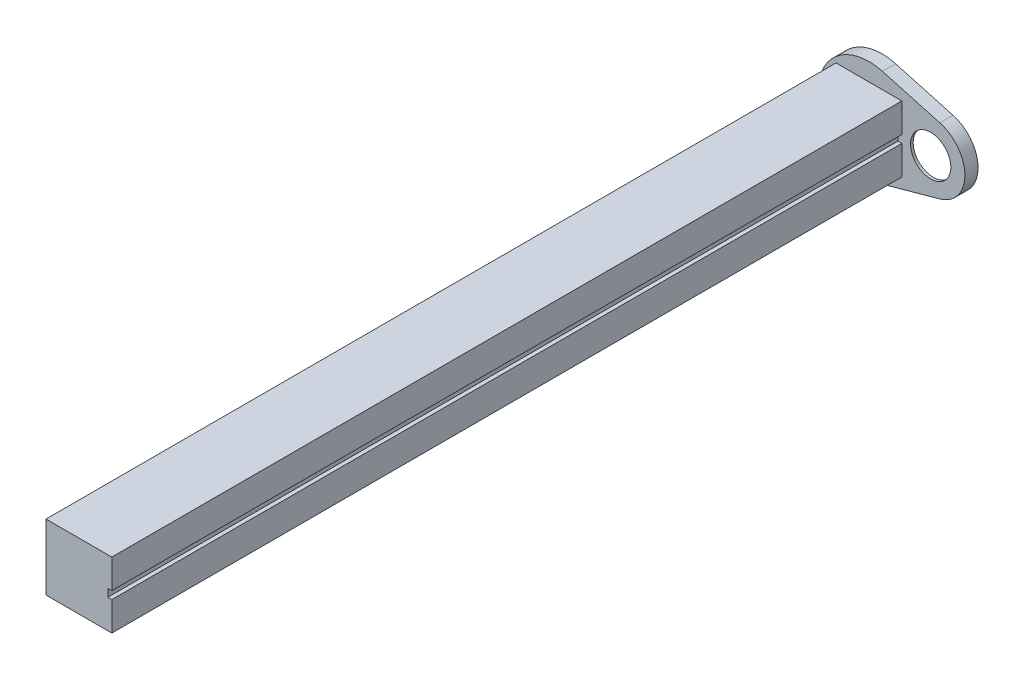
ISO-10303-21;
HEADER;
FILE_DESCRIPTION(('STEP AP214'),'2;1');
FILE_NAME('part.step','',(''),(''),'','','');
FILE_SCHEMA(('AUTOMOTIVE_DESIGN { 1 0 10303 214 1 1 1 1 }'));
ENDSEC;
DATA;
#1=APPLICATION_CONTEXT('core data for automotive mechanical design processes');
#2=APPLICATION_PROTOCOL_DEFINITION('international standard','automotive_design',2000,#1);
#3=PRODUCT_CONTEXT('',#1,'mechanical');
#4=PRODUCT('Part','Part','',(#3));
#5=PRODUCT_RELATED_PRODUCT_CATEGORY('part','',(#4));
#6=PRODUCT_DEFINITION_FORMATION('','',#4);
#7=PRODUCT_DEFINITION_CONTEXT('part definition',#1,'design');
#8=PRODUCT_DEFINITION('design','',#6,#7);
#9=PRODUCT_DEFINITION_SHAPE('','',#8);
#10=(LENGTH_UNIT() NAMED_UNIT(*) SI_UNIT(.MILLI.,.METRE.));
#11=(NAMED_UNIT(*) PLANE_ANGLE_UNIT() SI_UNIT($,.RADIAN.));
#12=(NAMED_UNIT(*) SI_UNIT($,.STERADIAN.) SOLID_ANGLE_UNIT());
#13=UNCERTAINTY_MEASURE_WITH_UNIT(LENGTH_MEASURE(1.E-05),#10,'distance_accuracy_value','');
#14=(GEOMETRIC_REPRESENTATION_CONTEXT(3) GLOBAL_UNCERTAINTY_ASSIGNED_CONTEXT((#13)) GLOBAL_UNIT_ASSIGNED_CONTEXT((#10,
#11,#12)) REPRESENTATION_CONTEXT('',''));
#15=CARTESIAN_POINT('',(0.,0.,0.));
#16=DIRECTION('',(0.,0.,1.));
#17=DIRECTION('',(1.,0.,0.));
#18=AXIS2_PLACEMENT_3D('',#15,#16,#17);
#19=CARTESIAN_POINT('',(79.73,0.,-1037.));
#20=DIRECTION('',(0.,0.,1.));
#21=DIRECTION('',(1.,0.,0.));
#22=AXIS2_PLACEMENT_3D('',#19,#20,#21);
#23=CYLINDRICAL_SURFACE('',#22,26.01);
#24=CARTESIAN_POINT('',(79.73,0.,-1020.));
#25=DIRECTION('',(0.,0.,-1.));
#26=DIRECTION('',(-1.,0.,0.));
#27=AXIS2_PLACEMENT_3D('',#24,#25,#26);
#28=CIRCLE('',#27,26.01);
#29=CARTESIAN_POINT('',(53.72,0.,-1020.));
#30=VERTEX_POINT('',#29);
#31=EDGE_CURVE('E213',#30,#30,#28,.T.);
#32=ORIENTED_EDGE('',*,*,#31,.F.);
#33=EDGE_LOOP('',(#32));
#34=FACE_BOUND('',#33,.T.);
#35=CARTESIAN_POINT('',(79.73,0.,-1023.4));
#36=DIRECTION('',(0.,0.,-1.));
#37=DIRECTION('',(-1.,0.,0.));
#38=AXIS2_PLACEMENT_3D('',#35,#36,#37);
#39=CIRCLE('',#38,26.01);
#40=CARTESIAN_POINT('',(53.72,0.,-1023.4));
#41=VERTEX_POINT('',#40);
#42=EDGE_CURVE('E39',#41,#41,#39,.T.);
#43=ORIENTED_EDGE('',*,*,#42,.T.);
#44=EDGE_LOOP('',(#43));
#45=FACE_BOUND('',#44,.T.);
#46=ADVANCED_FACE('F35',(#34,#45),#23,.F.);
#47=CARTESIAN_POINT('',(42.5,42.5,-1020.));
#48=DIRECTION('',(1.,0.,0.));
#49=DIRECTION('',(0.,0.,-1.));
#50=AXIS2_PLACEMENT_3D('',#47,#48,#49);
#51=PLANE('',#50);
#52=DIRECTION('',(0.,0.,1.));
#53=VECTOR('',#52,1.);
#54=CARTESIAN_POINT('',(42.5,5.015,0.));
#55=LINE('',#54,#53);
#56=CARTESIAN_POINT('',(42.5,5.015,-1020.));
#57=VERTEX_POINT('',#56);
#58=CARTESIAN_POINT('',(42.5,5.015,0.));
#59=VERTEX_POINT('',#58);
#60=EDGE_CURVE('E250',#57,#59,#55,.T.);
#61=ORIENTED_EDGE('',*,*,#60,.F.);
#62=DIRECTION('',(0.,1.,0.));
#63=VECTOR('',#62,1.);
#64=CARTESIAN_POINT('',(42.5,42.5,-1020.));
#65=LINE('',#64,#63);
#66=CARTESIAN_POINT('',(42.5,42.5,-1020.));
#67=VERTEX_POINT('',#66);
#68=EDGE_CURVE('E309',#57,#67,#65,.T.);
#69=ORIENTED_EDGE('',*,*,#68,.T.);
#70=DIRECTION('',(0.,0.,1.));
#71=VECTOR('',#70,1.);
#72=CARTESIAN_POINT('',(42.5,42.5,-1020.));
#73=LINE('',#72,#71);
#74=CARTESIAN_POINT('',(42.5,42.5,0.));
#75=VERTEX_POINT('',#74);
#76=EDGE_CURVE('E44',#67,#75,#73,.T.);
#77=ORIENTED_EDGE('',*,*,#76,.T.);
#78=DIRECTION('',(0.,1.,0.));
#79=VECTOR('',#78,1.);
#80=CARTESIAN_POINT('',(42.5,42.5,0.));
#81=LINE('',#80,#79);
#82=EDGE_CURVE('E322',#59,#75,#81,.T.);
#83=ORIENTED_EDGE('',*,*,#82,.F.);
#84=EDGE_LOOP('',(#61,#69,#77,#83));
#85=FACE_BOUND('',#84,.T.);
#86=ADVANCED_FACE('F353',(#85),#51,.T.);
#87=CARTESIAN_POINT('',(-42.5,42.5,-1020.));
#88=DIRECTION('',(-1.,0.,0.));
#89=DIRECTION('',(0.,-1.,0.));
#90=AXIS2_PLACEMENT_3D('',#87,#88,#89);
#91=PLANE('',#90);
#92=DIRECTION('',(0.,-1.,0.));
#93=VECTOR('',#92,1.);
#94=CARTESIAN_POINT('',(-42.5,42.5,0.));
#95=LINE('',#94,#93);
#96=CARTESIAN_POINT('',(-42.5,42.5,0.));
#97=VERTEX_POINT('',#96);
#98=CARTESIAN_POINT('',(-42.5,-42.5,0.));
#99=VERTEX_POINT('',#98);
#100=EDGE_CURVE('E296',#97,#99,#95,.T.);
#101=ORIENTED_EDGE('',*,*,#100,.F.);
#102=DIRECTION('',(0.,0.,1.));
#103=VECTOR('',#102,1.);
#104=CARTESIAN_POINT('',(-42.5,42.5,-1020.));
#105=LINE('',#104,#103);
#106=CARTESIAN_POINT('',(-42.5,42.5,-1020.));
#107=VERTEX_POINT('',#106);
#108=EDGE_CURVE('E11',#107,#97,#105,.T.);
#109=ORIENTED_EDGE('',*,*,#108,.F.);
#110=DIRECTION('',(0.,-1.,0.));
#111=VECTOR('',#110,1.);
#112=CARTESIAN_POINT('',(-42.5,42.5,-1020.));
#113=LINE('',#112,#111);
#114=CARTESIAN_POINT('',(-42.5,-42.5,-1020.));
#115=VERTEX_POINT('',#114);
#116=EDGE_CURVE('E302',#107,#115,#113,.T.);
#117=ORIENTED_EDGE('',*,*,#116,.T.);
#118=DIRECTION('',(0.,0.,1.));
#119=VECTOR('',#118,1.);
#120=CARTESIAN_POINT('',(-42.5,-42.5,-1020.));
#121=LINE('',#120,#119);
#122=EDGE_CURVE('E316',#115,#99,#121,.T.);
#123=ORIENTED_EDGE('',*,*,#122,.T.);
#124=EDGE_LOOP('',(#101,#109,#117,#123));
#125=FACE_BOUND('',#124,.T.);
#126=ADVANCED_FACE('F37',(#125),#91,.T.);
#127=CARTESIAN_POINT('',(42.5,42.5,-1020.));
#128=DIRECTION('',(0.,1.,0.));
#129=DIRECTION('',(0.,0.,1.));
#130=AXIS2_PLACEMENT_3D('',#127,#128,#129);
#131=PLANE('',#130);
#132=DIRECTION('',(-1.,0.,0.));
#133=VECTOR('',#132,1.);
#134=CARTESIAN_POINT('',(42.5,42.5,0.));
#135=LINE('',#134,#133);
#136=EDGE_CURVE('E306',#75,#97,#135,.T.);
#137=ORIENTED_EDGE('',*,*,#136,.F.);
#138=ORIENTED_EDGE('',*,*,#76,.F.);
#139=DIRECTION('',(-1.,0.,0.));
#140=VECTOR('',#139,1.);
#141=CARTESIAN_POINT('',(42.5,42.5,-1020.));
#142=LINE('',#141,#140);
#143=EDGE_CURVE('E313',#67,#107,#142,.T.);
#144=ORIENTED_EDGE('',*,*,#143,.T.);
#145=ORIENTED_EDGE('',*,*,#108,.T.);
#146=EDGE_LOOP('',(#137,#138,#144,#145));
#147=FACE_BOUND('',#146,.T.);
#148=ADVANCED_FACE('F346',(#147),#131,.T.);
#149=DIRECTION('',(0.,0.,-1.));
#150=VECTOR('',#149,1.);
#151=CARTESIAN_POINT('',(42.5,-5.015,0.));
#152=LINE('',#151,#150);
#153=CARTESIAN_POINT('',(42.5,-5.015,0.));
#154=VERTEX_POINT('',#153);
#155=CARTESIAN_POINT('',(42.5,-5.015,-1020.));
#156=VERTEX_POINT('',#155);
#157=EDGE_CURVE('E246',#154,#156,#152,.T.);
#158=ORIENTED_EDGE('',*,*,#157,.F.);
#159=CARTESIAN_POINT('',(42.5,-42.5,0.));
#160=VERTEX_POINT('',#159);
#161=EDGE_CURVE('E323',#160,#154,#81,.T.);
#162=ORIENTED_EDGE('',*,*,#161,.F.);
#163=DIRECTION('',(0.,0.,1.));
#164=VECTOR('',#163,1.);
#165=CARTESIAN_POINT('',(42.5,-42.5,-1020.));
#166=LINE('',#165,#164);
#167=CARTESIAN_POINT('',(42.5,-42.5,-1020.));
#168=VERTEX_POINT('',#167);
#169=EDGE_CURVE('E330',#168,#160,#166,.T.);
#170=ORIENTED_EDGE('',*,*,#169,.F.);
#171=EDGE_CURVE('E310',#168,#156,#65,.T.);
#172=ORIENTED_EDGE('',*,*,#171,.T.);
#173=EDGE_LOOP('',(#158,#162,#170,#172));
#174=FACE_BOUND('',#173,.T.);
#175=ADVANCED_FACE('F364',(#174),#51,.T.);
#176=CARTESIAN_POINT('',(42.5,-42.5,-1020.));
#177=DIRECTION('',(0.,-1.,0.));
#178=DIRECTION('',(0.,0.,-1.));
#179=AXIS2_PLACEMENT_3D('',#176,#177,#178);
#180=PLANE('',#179);
#181=DIRECTION('',(1.,0.,0.));
#182=VECTOR('',#181,1.);
#183=CARTESIAN_POINT('',(42.5,-42.5,0.));
#184=LINE('',#183,#182);
#185=EDGE_CURVE('E319',#99,#160,#184,.T.);
#186=ORIENTED_EDGE('',*,*,#185,.F.);
#187=ORIENTED_EDGE('',*,*,#122,.F.);
#188=DIRECTION('',(1.,0.,0.));
#189=VECTOR('',#188,1.);
#190=CARTESIAN_POINT('',(42.5,-42.5,-1020.));
#191=LINE('',#190,#189);
#192=EDGE_CURVE('E305',#115,#168,#191,.T.);
#193=ORIENTED_EDGE('',*,*,#192,.T.);
#194=ORIENTED_EDGE('',*,*,#169,.T.);
#195=EDGE_LOOP('',(#186,#187,#193,#194));
#196=FACE_BOUND('',#195,.T.);
#197=ADVANCED_FACE('F337',(#196),#180,.T.);
#198=CARTESIAN_POINT('',(0.,0.,0.));
#199=DIRECTION('',(0.,0.,1.));
#200=DIRECTION('',(1.,0.,0.));
#201=AXIS2_PLACEMENT_3D('',#198,#199,#200);
#202=PLANE('',#201);
#203=DIRECTION('',(1.,0.,0.));
#204=VECTOR('',#203,1.);
#205=CARTESIAN_POINT('',(37.4,5.015,0.));
#206=LINE('',#205,#204);
#207=CARTESIAN_POINT('',(37.4,5.015,0.));
#208=VERTEX_POINT('',#207);
#209=EDGE_CURVE('E260',#208,#59,#206,.T.);
#210=ORIENTED_EDGE('',*,*,#209,.T.);
#211=ORIENTED_EDGE('',*,*,#82,.T.);
#212=ORIENTED_EDGE('',*,*,#136,.T.);
#213=ORIENTED_EDGE('',*,*,#100,.T.);
#214=ORIENTED_EDGE('',*,*,#185,.T.);
#215=ORIENTED_EDGE('',*,*,#161,.T.);
#216=DIRECTION('',(1.,0.,0.));
#217=VECTOR('',#216,1.);
#218=CARTESIAN_POINT('',(37.4,-5.015,0.));
#219=LINE('',#218,#217);
#220=CARTESIAN_POINT('',(37.4,-5.015,0.));
#221=VERTEX_POINT('',#220);
#222=EDGE_CURVE('E256',#221,#154,#219,.T.);
#223=ORIENTED_EDGE('',*,*,#222,.F.);
#224=DIRECTION('',(0.,-1.,0.));
#225=VECTOR('',#224,1.);
#226=CARTESIAN_POINT('',(37.4,-5.015,0.));
#227=LINE('',#226,#225);
#228=EDGE_CURVE('E247',#208,#221,#227,.T.);
#229=ORIENTED_EDGE('',*,*,#228,.F.);
#230=EDGE_LOOP('',(#210,#211,#212,#213,#214,#215,#223,#229));
#231=FACE_BOUND('',#230,.T.);
#232=ADVANCED_FACE('F341',(#231),#202,.T.);
#233=CARTESIAN_POINT('',(37.4,5.015,0.));
#234=DIRECTION('',(0.,1.,0.));
#235=DIRECTION('',(0.,0.,1.));
#236=AXIS2_PLACEMENT_3D('',#233,#234,#235);
#237=PLANE('',#236);
#238=ORIENTED_EDGE('',*,*,#60,.T.);
#239=ORIENTED_EDGE('',*,*,#209,.F.);
#240=DIRECTION('',(0.,0.,1.));
#241=VECTOR('',#240,1.);
#242=CARTESIAN_POINT('',(37.4,5.015,0.));
#243=LINE('',#242,#241);
#244=CARTESIAN_POINT('',(37.4,5.015,-1020.));
#245=VERTEX_POINT('',#244);
#246=EDGE_CURVE('E60',#245,#208,#243,.T.);
#247=ORIENTED_EDGE('',*,*,#246,.F.);
#248=DIRECTION('',(1.,0.,0.));
#249=VECTOR('',#248,1.);
#250=CARTESIAN_POINT('',(37.4,5.015,-1020.));
#251=LINE('',#250,#249);
#252=EDGE_CURVE('E264',#245,#57,#251,.T.);
#253=ORIENTED_EDGE('',*,*,#252,.T.);
#254=EDGE_LOOP('',(#238,#239,#247,#253));
#255=FACE_BOUND('',#254,.T.);
#256=ADVANCED_FACE('F355',(#255),#237,.F.);
#257=CARTESIAN_POINT('',(37.4,-5.015,0.));
#258=DIRECTION('',(0.,-1.,0.));
#259=DIRECTION('',(0.,0.,-1.));
#260=AXIS2_PLACEMENT_3D('',#257,#258,#259);
#261=PLANE('',#260);
#262=ORIENTED_EDGE('',*,*,#157,.T.);
#263=DIRECTION('',(1.,0.,0.));
#264=VECTOR('',#263,1.);
#265=CARTESIAN_POINT('',(37.4,-5.015,-1020.));
#266=LINE('',#265,#264);
#267=CARTESIAN_POINT('',(37.4,-5.015,-1020.));
#268=VERTEX_POINT('',#267);
#269=EDGE_CURVE('E267',#268,#156,#266,.T.);
#270=ORIENTED_EDGE('',*,*,#269,.F.);
#271=DIRECTION('',(0.,0.,-1.));
#272=VECTOR('',#271,1.);
#273=CARTESIAN_POINT('',(37.4,-5.015,0.));
#274=LINE('',#273,#272);
#275=EDGE_CURVE('E249',#221,#268,#274,.T.);
#276=ORIENTED_EDGE('',*,*,#275,.F.);
#277=ORIENTED_EDGE('',*,*,#222,.T.);
#278=EDGE_LOOP('',(#262,#270,#276,#277));
#279=FACE_BOUND('',#278,.T.);
#280=ADVANCED_FACE('F361',(#279),#261,.F.);
#281=CARTESIAN_POINT('',(37.4,0.,0.));
#282=DIRECTION('',(-1.,0.,0.));
#283=DIRECTION('',(0.,0.,1.));
#284=AXIS2_PLACEMENT_3D('',#281,#282,#283);
#285=PLANE('',#284);
#286=ORIENTED_EDGE('',*,*,#228,.T.);
#287=ORIENTED_EDGE('',*,*,#275,.T.);
#288=DIRECTION('',(0.,1.,0.));
#289=VECTOR('',#288,1.);
#290=CARTESIAN_POINT('',(37.4,-5.015,-1020.));
#291=LINE('',#290,#289);
#292=EDGE_CURVE('E253',#268,#245,#291,.T.);
#293=ORIENTED_EDGE('',*,*,#292,.T.);
#294=ORIENTED_EDGE('',*,*,#246,.T.);
#295=EDGE_LOOP('',(#286,#287,#293,#294));
#296=FACE_BOUND('',#295,.T.);
#297=ADVANCED_FACE('F358',(#296),#285,.F.);
#298=CARTESIAN_POINT('',(0.,0.,-1037.));
#299=DIRECTION('',(0.,0.,-1.));
#300=DIRECTION('',(-1.,0.,0.));
#301=AXIS2_PLACEMENT_3D('',#298,#299,#300);
#302=PLANE('',#301);
#303=CARTESIAN_POINT('',(0.,0.,-1037.));
#304=DIRECTION('',(0.,0.,-1.));
#305=DIRECTION('',(-1.,0.,0.));
#306=AXIS2_PLACEMENT_3D('',#303,#304,#305);
#307=CIRCLE('',#306,56.95);
#308=CARTESIAN_POINT('',(15.1866666666667,-54.887773279261,-1037.));
#309=VERTEX_POINT('',#308);
#310=CARTESIAN_POINT('',(15.1866666666667,54.887773279261,-1037.));
#311=VERTEX_POINT('',#310);
#312=EDGE_CURVE('E52',#309,#311,#307,.T.);
#313=ORIENTED_EDGE('',*,*,#312,.F.);
#314=DIRECTION('',(-0.963788819653397,-0.266666666666666,0.));
#315=VECTOR('',#314,1.);
#316=CARTESIAN_POINT('',(89.2469777777778,-34.3963379216703,-1037.));
#317=LINE('',#316,#315);
#318=CARTESIAN_POINT('',(89.2469777777778,-34.3963379216703,-1037.));
#319=VERTEX_POINT('',#318);
#320=EDGE_CURVE('E195',#319,#309,#317,.T.);
#321=ORIENTED_EDGE('',*,*,#320,.F.);
#322=CARTESIAN_POINT('',(79.73,0.,-1037.));
#323=DIRECTION('',(0.,0.,-1.));
#324=DIRECTION('',(-1.,0.,0.));
#325=AXIS2_PLACEMENT_3D('',#322,#323,#324);
#326=CIRCLE('',#325,35.6886666666667);
#327=CARTESIAN_POINT('',(89.2469777777778,34.3963379216703,-1037.));
#328=VERTEX_POINT('',#327);
#329=EDGE_CURVE('E198',#328,#319,#326,.T.);
#330=ORIENTED_EDGE('',*,*,#329,.F.);
#331=DIRECTION('',(0.963788819653398,-0.266666666666666,0.));
#332=VECTOR('',#331,1.);
#333=CARTESIAN_POINT('',(15.1866666666667,54.887773279261,-1037.));
#334=LINE('',#333,#332);
#335=EDGE_CURVE('E204',#311,#328,#334,.T.);
#336=ORIENTED_EDGE('',*,*,#335,.F.);
#337=EDGE_LOOP('',(#313,#321,#330,#336));
#338=FACE_BOUND('',#337,.T.);
#339=CARTESIAN_POINT('',(0.,0.,-1037.));
#340=DIRECTION('',(0.,0.,-1.));
#341=DIRECTION('',(-1.,0.,0.));
#342=AXIS2_PLACEMENT_3D('',#339,#340,#341);
#343=CIRCLE('',#342,65.45);
#344=CARTESIAN_POINT('',(17.4533333333333,-63.0799782463149,-1037.));
#345=VERTEX_POINT('',#344);
#346=CARTESIAN_POINT('',(17.4533333333333,63.0799782463149,-1037.));
#347=VERTEX_POINT('',#346);
#348=EDGE_CURVE('E217',#345,#347,#343,.T.);
#349=ORIENTED_EDGE('',*,*,#348,.T.);
#350=DIRECTION('',(0.963788819653397,-0.266666666666666,0.));
#351=VECTOR('',#350,1.);
#352=CARTESIAN_POINT('',(17.4533333333333,63.0799782463149,-1037.));
#353=LINE('',#352,#351);
#354=CARTESIAN_POINT('',(91.5136444444445,42.5885428887242,-1037.));
#355=VERTEX_POINT('',#354);
#356=EDGE_CURVE('E220',#347,#355,#353,.T.);
#357=ORIENTED_EDGE('',*,*,#356,.T.);
#358=CARTESIAN_POINT('',(79.73,0.,-1037.));
#359=DIRECTION('',(0.,0.,-1.));
#360=DIRECTION('',(-1.,0.,0.));
#361=AXIS2_PLACEMENT_3D('',#358,#359,#360);
#362=CIRCLE('',#361,44.1886666666667);
#363=CARTESIAN_POINT('',(91.5136444444445,-42.5885428887242,-1037.));
#364=VERTEX_POINT('',#363);
#365=EDGE_CURVE('E223',#355,#364,#362,.T.);
#366=ORIENTED_EDGE('',*,*,#365,.T.);
#367=DIRECTION('',(-0.963788819653398,-0.266666666666666,0.));
#368=VECTOR('',#367,1.);
#369=CARTESIAN_POINT('',(91.5136444444445,-42.5885428887242,-1037.));
#370=LINE('',#369,#368);
#371=EDGE_CURVE('E225',#364,#345,#370,.T.);
#372=ORIENTED_EDGE('',*,*,#371,.T.);
#373=EDGE_LOOP('',(#349,#357,#366,#372));
#374=FACE_BOUND('',#373,.T.);
#375=ADVANCED_FACE('F383',(#338,#374),#302,.T.);
#376=CARTESIAN_POINT('',(0.,0.,-1020.));
#377=DIRECTION('',(0.,0.,-1.));
#378=DIRECTION('',(-1.,0.,0.));
#379=AXIS2_PLACEMENT_3D('',#376,#377,#378);
#380=PLANE('',#379);
#381=ORIENTED_EDGE('',*,*,#68,.F.);
#382=ORIENTED_EDGE('',*,*,#252,.F.);
#383=ORIENTED_EDGE('',*,*,#292,.F.);
#384=ORIENTED_EDGE('',*,*,#269,.T.);
#385=ORIENTED_EDGE('',*,*,#171,.F.);
#386=ORIENTED_EDGE('',*,*,#192,.F.);
#387=ORIENTED_EDGE('',*,*,#116,.F.);
#388=ORIENTED_EDGE('',*,*,#143,.F.);
#389=EDGE_LOOP('',(#381,#382,#383,#384,#385,#386,#387,#388));
#390=FACE_BOUND('',#389,.T.);
#391=CARTESIAN_POINT('',(0.,0.,-1020.));
#392=DIRECTION('',(0.,0.,-1.));
#393=DIRECTION('',(-1.,0.,0.));
#394=AXIS2_PLACEMENT_3D('',#391,#392,#393);
#395=CIRCLE('',#394,65.45);
#396=CARTESIAN_POINT('',(17.4533333333333,-63.0799782463149,-1020.));
#397=VERTEX_POINT('',#396);
#398=CARTESIAN_POINT('',(17.4533333333333,63.0799782463149,-1020.));
#399=VERTEX_POINT('',#398);
#400=EDGE_CURVE('E216',#397,#399,#395,.T.);
#401=ORIENTED_EDGE('',*,*,#400,.F.);
#402=DIRECTION('',(-0.963788819653398,-0.266666666666666,0.));
#403=VECTOR('',#402,1.);
#404=CARTESIAN_POINT('',(91.5136444444445,-42.5885428887242,-1020.));
#405=LINE('',#404,#403);
#406=CARTESIAN_POINT('',(91.5136444444445,-42.5885428887242,-1020.));
#407=VERTEX_POINT('',#406);
#408=EDGE_CURVE('E221',#407,#397,#405,.T.);
#409=ORIENTED_EDGE('',*,*,#408,.F.);
#410=CARTESIAN_POINT('',(79.73,0.,-1020.));
#411=DIRECTION('',(0.,0.,-1.));
#412=DIRECTION('',(-1.,0.,0.));
#413=AXIS2_PLACEMENT_3D('',#410,#411,#412);
#414=CIRCLE('',#413,44.1886666666667);
#415=CARTESIAN_POINT('',(91.5136444444445,42.5885428887242,-1020.));
#416=VERTEX_POINT('',#415);
#417=EDGE_CURVE('E232',#416,#407,#414,.T.);
#418=ORIENTED_EDGE('',*,*,#417,.F.);
#419=DIRECTION('',(0.963788819653397,-0.266666666666666,0.));
#420=VECTOR('',#419,1.);
#421=CARTESIAN_POINT('',(17.4533333333333,63.0799782463149,-1020.));
#422=LINE('',#421,#420);
#423=EDGE_CURVE('E230',#399,#416,#422,.T.);
#424=ORIENTED_EDGE('',*,*,#423,.F.);
#425=EDGE_LOOP('',(#401,#409,#418,#424));
#426=FACE_BOUND('',#425,.T.);
#427=ORIENTED_EDGE('',*,*,#31,.T.);
#428=EDGE_LOOP('',(#427));
#429=FACE_BOUND('',#428,.T.);
#430=ADVANCED_FACE('F349',(#390,#426,#429),#380,.F.);
#431=CARTESIAN_POINT('',(0.,0.,-1037.));
#432=DIRECTION('',(0.,0.,1.));
#433=DIRECTION('',(1.,0.,0.));
#434=AXIS2_PLACEMENT_3D('',#431,#432,#433);
#435=CYLINDRICAL_SURFACE('',#434,65.45);
#436=ORIENTED_EDGE('',*,*,#400,.T.);
#437=DIRECTION('',(0.,0.,1.));
#438=VECTOR('',#437,1.);
#439=CARTESIAN_POINT('',(17.4533333333333,63.0799782463149,-1037.));
#440=LINE('',#439,#438);
#441=EDGE_CURVE('E243',#347,#399,#440,.T.);
#442=ORIENTED_EDGE('',*,*,#441,.F.);
#443=ORIENTED_EDGE('',*,*,#348,.F.);
#444=DIRECTION('',(0.,0.,1.));
#445=VECTOR('',#444,1.);
#446=CARTESIAN_POINT('',(17.4533333333333,-63.0799782463149,-1037.));
#447=LINE('',#446,#445);
#448=EDGE_CURVE('E227',#345,#397,#447,.T.);
#449=ORIENTED_EDGE('',*,*,#448,.T.);
#450=EDGE_LOOP('',(#436,#442,#443,#449));
#451=FACE_BOUND('',#450,.T.);
#452=ADVANCED_FACE('F389',(#451),#435,.T.);
#453=CARTESIAN_POINT('',(17.4533333333333,63.0799782463149,-1037.));
#454=DIRECTION('',(-0.266666666666666,-0.963788819653398,0.));
#455=DIRECTION('',(0.963788819653398,-0.266666666666666,0.));
#456=AXIS2_PLACEMENT_3D('',#453,#454,#455);
#457=PLANE('',#456);
#458=ORIENTED_EDGE('',*,*,#423,.T.);
#459=DIRECTION('',(0.,0.,1.));
#460=VECTOR('',#459,1.);
#461=CARTESIAN_POINT('',(91.5136444444445,42.5885428887242,-1037.));
#462=LINE('',#461,#460);
#463=EDGE_CURVE('E240',#355,#416,#462,.T.);
#464=ORIENTED_EDGE('',*,*,#463,.F.);
#465=ORIENTED_EDGE('',*,*,#356,.F.);
#466=ORIENTED_EDGE('',*,*,#441,.T.);
#467=EDGE_LOOP('',(#458,#464,#465,#466));
#468=FACE_BOUND('',#467,.T.);
#469=ADVANCED_FACE('F397',(#468),#457,.F.);
#470=CARTESIAN_POINT('',(79.73,0.,-1037.));
#471=DIRECTION('',(0.,0.,1.));
#472=DIRECTION('',(1.,0.,0.));
#473=AXIS2_PLACEMENT_3D('',#470,#471,#472);
#474=CYLINDRICAL_SURFACE('',#473,44.1886666666667);
#475=ORIENTED_EDGE('',*,*,#417,.T.);
#476=DIRECTION('',(0.,0.,1.));
#477=VECTOR('',#476,1.);
#478=CARTESIAN_POINT('',(91.5136444444445,-42.5885428887242,-1037.));
#479=LINE('',#478,#477);
#480=EDGE_CURVE('E237',#364,#407,#479,.T.);
#481=ORIENTED_EDGE('',*,*,#480,.F.);
#482=ORIENTED_EDGE('',*,*,#365,.F.);
#483=ORIENTED_EDGE('',*,*,#463,.T.);
#484=EDGE_LOOP('',(#475,#481,#482,#483));
#485=FACE_BOUND('',#484,.T.);
#486=ADVANCED_FACE('F393',(#485),#474,.T.);
#487=CARTESIAN_POINT('',(91.5136444444445,-42.5885428887242,-1037.));
#488=DIRECTION('',(-0.266666666666666,0.963788819653398,0.));
#489=DIRECTION('',(-0.963788819653398,-0.266666666666666,0.));
#490=AXIS2_PLACEMENT_3D('',#487,#488,#489);
#491=PLANE('',#490);
#492=ORIENTED_EDGE('',*,*,#408,.T.);
#493=ORIENTED_EDGE('',*,*,#448,.F.);
#494=ORIENTED_EDGE('',*,*,#371,.F.);
#495=ORIENTED_EDGE('',*,*,#480,.T.);
#496=EDGE_LOOP('',(#492,#493,#494,#495));
#497=FACE_BOUND('',#496,.T.);
#498=ADVANCED_FACE('F390',(#497),#491,.F.);
#499=CARTESIAN_POINT('',(0.,0.,-1023.4));
#500=DIRECTION('',(0.,0.,-1.));
#501=DIRECTION('',(-1.,0.,0.));
#502=AXIS2_PLACEMENT_3D('',#499,#500,#501);
#503=CYLINDRICAL_SURFACE('',#502,56.95);
#504=ORIENTED_EDGE('',*,*,#312,.T.);
#505=DIRECTION('',(0.,0.,-1.));
#506=VECTOR('',#505,1.);
#507=CARTESIAN_POINT('',(15.1866666666667,54.887773279261,-1023.4));
#508=LINE('',#507,#506);
#509=CARTESIAN_POINT('',(15.1866666666667,54.887773279261,-1023.4));
#510=VERTEX_POINT('',#509);
#511=EDGE_CURVE('E173',#510,#311,#508,.T.);
#512=ORIENTED_EDGE('',*,*,#511,.F.);
#513=CARTESIAN_POINT('',(0.,0.,-1023.4));
#514=DIRECTION('',(0.,0.,-1.));
#515=DIRECTION('',(-1.,0.,0.));
#516=AXIS2_PLACEMENT_3D('',#513,#514,#515);
#517=CIRCLE('',#516,56.95);
#518=CARTESIAN_POINT('',(15.1866666666667,-54.887773279261,-1023.4));
#519=VERTEX_POINT('',#518);
#520=EDGE_CURVE('E177',#519,#510,#517,.T.);
#521=ORIENTED_EDGE('',*,*,#520,.F.);
#522=DIRECTION('',(0.,0.,-1.));
#523=VECTOR('',#522,1.);
#524=CARTESIAN_POINT('',(15.1866666666667,-54.887773279261,-1023.4));
#525=LINE('',#524,#523);
#526=EDGE_CURVE('E208',#519,#309,#525,.T.);
#527=ORIENTED_EDGE('',*,*,#526,.T.);
#528=EDGE_LOOP('',(#504,#512,#521,#527));
#529=FACE_BOUND('',#528,.T.);
#530=ADVANCED_FACE('F175',(#529),#503,.F.);
#531=CARTESIAN_POINT('',(89.2469777777778,-34.3963379216703,-1023.4));
#532=DIRECTION('',(0.266666666666666,-0.963788819653397,0.));
#533=DIRECTION('',(0.963788819653397,0.266666666666666,0.));
#534=AXIS2_PLACEMENT_3D('',#531,#532,#533);
#535=PLANE('',#534);
#536=ORIENTED_EDGE('',*,*,#320,.T.);
#537=ORIENTED_EDGE('',*,*,#526,.F.);
#538=DIRECTION('',(-0.963788819653397,-0.266666666666666,0.));
#539=VECTOR('',#538,1.);
#540=CARTESIAN_POINT('',(89.2469777777778,-34.3963379216703,-1023.4));
#541=LINE('',#540,#539);
#542=CARTESIAN_POINT('',(89.2469777777778,-34.3963379216703,-1023.4));
#543=VERTEX_POINT('',#542);
#544=EDGE_CURVE('E183',#543,#519,#541,.T.);
#545=ORIENTED_EDGE('',*,*,#544,.F.);
#546=DIRECTION('',(0.,0.,-1.));
#547=VECTOR('',#546,1.);
#548=CARTESIAN_POINT('',(89.2469777777778,-34.3963379216703,-1023.4));
#549=LINE('',#548,#547);
#550=EDGE_CURVE('E210',#543,#319,#549,.T.);
#551=ORIENTED_EDGE('',*,*,#550,.T.);
#552=EDGE_LOOP('',(#536,#537,#545,#551));
#553=FACE_BOUND('',#552,.T.);
#554=ADVANCED_FACE('F483',(#553),#535,.F.);
#555=CARTESIAN_POINT('',(79.73,0.,-1023.4));
#556=DIRECTION('',(0.,0.,-1.));
#557=DIRECTION('',(-1.,0.,0.));
#558=AXIS2_PLACEMENT_3D('',#555,#556,#557);
#559=CYLINDRICAL_SURFACE('',#558,35.6886666666667);
#560=ORIENTED_EDGE('',*,*,#329,.T.);
#561=ORIENTED_EDGE('',*,*,#550,.F.);
#562=CARTESIAN_POINT('',(79.73,0.,-1023.4));
#563=DIRECTION('',(0.,0.,-1.));
#564=DIRECTION('',(-1.,0.,0.));
#565=AXIS2_PLACEMENT_3D('',#562,#563,#564);
#566=CIRCLE('',#565,35.6886666666667);
#567=CARTESIAN_POINT('',(89.2469777777778,34.3963379216703,-1023.4));
#568=VERTEX_POINT('',#567);
#569=EDGE_CURVE('E191',#568,#543,#566,.T.);
#570=ORIENTED_EDGE('',*,*,#569,.F.);
#571=DIRECTION('',(0.,0.,-1.));
#572=VECTOR('',#571,1.);
#573=CARTESIAN_POINT('',(89.2469777777778,34.3963379216703,-1023.4));
#574=LINE('',#573,#572);
#575=EDGE_CURVE('E182',#568,#328,#574,.T.);
#576=ORIENTED_EDGE('',*,*,#575,.T.);
#577=EDGE_LOOP('',(#560,#561,#570,#576));
#578=FACE_BOUND('',#577,.T.);
#579=ADVANCED_FACE('F489',(#578),#559,.F.);
#580=CARTESIAN_POINT('',(15.1866666666667,54.887773279261,-1023.4));
#581=DIRECTION('',(0.266666666666666,0.963788819653398,0.));
#582=DIRECTION('',(-0.963788819653398,0.266666666666666,0.));
#583=AXIS2_PLACEMENT_3D('',#580,#581,#582);
#584=PLANE('',#583);
#585=ORIENTED_EDGE('',*,*,#335,.T.);
#586=ORIENTED_EDGE('',*,*,#575,.F.);
#587=DIRECTION('',(0.963788819653398,-0.266666666666666,0.));
#588=VECTOR('',#587,1.);
#589=CARTESIAN_POINT('',(15.1866666666667,54.887773279261,-1023.4));
#590=LINE('',#589,#588);
#591=EDGE_CURVE('E186',#510,#568,#590,.T.);
#592=ORIENTED_EDGE('',*,*,#591,.F.);
#593=ORIENTED_EDGE('',*,*,#511,.T.);
#594=EDGE_LOOP('',(#585,#586,#592,#593));
#595=FACE_BOUND('',#594,.T.);
#596=ADVANCED_FACE('F187',(#595),#584,.F.);
#597=CARTESIAN_POINT('',(0.,0.,-1023.4));
#598=DIRECTION('',(0.,0.,-1.));
#599=DIRECTION('',(-1.,0.,0.));
#600=AXIS2_PLACEMENT_3D('',#597,#598,#599);
#601=PLANE('',#600);
#602=ORIENTED_EDGE('',*,*,#42,.F.);
#603=EDGE_LOOP('',(#602));
#604=FACE_BOUND('',#603,.T.);
#605=ORIENTED_EDGE('',*,*,#520,.T.);
#606=ORIENTED_EDGE('',*,*,#591,.T.);
#607=ORIENTED_EDGE('',*,*,#569,.T.);
#608=ORIENTED_EDGE('',*,*,#544,.T.);
#609=EDGE_LOOP('',(#605,#606,#607,#608));
#610=FACE_BOUND('',#609,.T.);
#611=ADVANCED_FACE('F193',(#604,#610),#601,.T.);
#612=CLOSED_SHELL('',(#46,#86,#126,#148,#175,#197,#232,#256,#280,#297,#375,#430,#452,#469,#486,
#498,#530,#554,#579,#596,#611));
#613=CARTESIAN_POINT('',(-34.,0.,-1018.3));
#614=DIRECTION('',(-1.,0.,0.));
#615=DIRECTION('',(0.,-1.,0.));
#616=AXIS2_PLACEMENT_3D('',#613,#614,#615);
#617=PLANE('',#616);
#618=DIRECTION('',(0.,-1.,0.));
#619=VECTOR('',#618,1.);
#620=CARTESIAN_POINT('',(-34.,0.,-1.7));
#621=LINE('',#620,#619);
#622=CARTESIAN_POINT('',(-34.,34.,-1.7));
#623=VERTEX_POINT('',#622);
#624=CARTESIAN_POINT('',(-34.,-34.,-1.7));
#625=VERTEX_POINT('',#624);
#626=EDGE_CURVE('E263',#623,#625,#621,.T.);
#627=ORIENTED_EDGE('',*,*,#626,.T.);
#628=DIRECTION('',(0.,0.,1.));
#629=VECTOR('',#628,1.);
#630=CARTESIAN_POINT('',(-34.,-34.,-1018.3));
#631=LINE('',#630,#629);
#632=CARTESIAN_POINT('',(-34.,-34.,-1018.3));
#633=VERTEX_POINT('',#632);
#634=EDGE_CURVE('E283',#633,#625,#631,.T.);
#635=ORIENTED_EDGE('',*,*,#634,.F.);
#636=DIRECTION('',(0.,-1.,0.));
#637=VECTOR('',#636,1.);
#638=CARTESIAN_POINT('',(-34.,0.,-1018.3));
#639=LINE('',#638,#637);
#640=CARTESIAN_POINT('',(-34.,34.,-1018.3));
#641=VERTEX_POINT('',#640);
#642=EDGE_CURVE('E270',#641,#633,#639,.T.);
#643=ORIENTED_EDGE('',*,*,#642,.F.);
#644=DIRECTION('',(0.,0.,1.));
#645=VECTOR('',#644,1.);
#646=CARTESIAN_POINT('',(-34.,34.,-1018.3));
#647=LINE('',#646,#645);
#648=EDGE_CURVE('E294',#641,#623,#647,.T.);
#649=ORIENTED_EDGE('',*,*,#648,.T.);
#650=EDGE_LOOP('',(#627,#635,#643,#649));
#651=FACE_BOUND('',#650,.T.);
#652=ADVANCED_FACE('F425',(#651),#617,.F.);
#653=CARTESIAN_POINT('',(0.,34.,-1018.3));
#654=DIRECTION('',(0.,1.,0.));
#655=DIRECTION('',(0.,0.,1.));
#656=AXIS2_PLACEMENT_3D('',#653,#654,#655);
#657=PLANE('',#656);
#658=DIRECTION('',(-1.,0.,0.));
#659=VECTOR('',#658,1.);
#660=CARTESIAN_POINT('',(0.,34.,-1.7));
#661=LINE('',#660,#659);
#662=CARTESIAN_POINT('',(34.,34.,-1.7));
#663=VERTEX_POINT('',#662);
#664=EDGE_CURVE('E274',#663,#623,#661,.T.);
#665=ORIENTED_EDGE('',*,*,#664,.T.);
#666=ORIENTED_EDGE('',*,*,#648,.F.);
#667=DIRECTION('',(-1.,0.,0.));
#668=VECTOR('',#667,1.);
#669=CARTESIAN_POINT('',(0.,34.,-1018.3));
#670=LINE('',#669,#668);
#671=CARTESIAN_POINT('',(34.,34.,-1018.3));
#672=VERTEX_POINT('',#671);
#673=EDGE_CURVE('E280',#672,#641,#670,.T.);
#674=ORIENTED_EDGE('',*,*,#673,.F.);
#675=DIRECTION('',(0.,0.,1.));
#676=VECTOR('',#675,1.);
#677=CARTESIAN_POINT('',(34.,34.,-1018.3));
#678=LINE('',#677,#676);
#679=EDGE_CURVE('E297',#672,#663,#678,.T.);
#680=ORIENTED_EDGE('',*,*,#679,.T.);
#681=EDGE_LOOP('',(#665,#666,#674,#680));
#682=FACE_BOUND('',#681,.T.);
#683=ADVANCED_FACE('F421',(#682),#657,.F.);
#684=CARTESIAN_POINT('',(34.,0.,-1018.3));
#685=DIRECTION('',(1.,0.,0.));
#686=DIRECTION('',(0.,0.,-1.));
#687=AXIS2_PLACEMENT_3D('',#684,#685,#686);
#688=PLANE('',#687);
#689=DIRECTION('',(0.,1.,0.));
#690=VECTOR('',#689,1.);
#691=CARTESIAN_POINT('',(34.,0.,-1.7));
#692=LINE('',#691,#690);
#693=CARTESIAN_POINT('',(34.,-34.,-1.7));
#694=VERTEX_POINT('',#693);
#695=EDGE_CURVE('E289',#694,#663,#692,.T.);
#696=ORIENTED_EDGE('',*,*,#695,.T.);
#697=ORIENTED_EDGE('',*,*,#679,.F.);
#698=DIRECTION('',(0.,1.,0.));
#699=VECTOR('',#698,1.);
#700=CARTESIAN_POINT('',(34.,0.,-1018.3));
#701=LINE('',#700,#699);
#702=CARTESIAN_POINT('',(34.,-34.,-1018.3));
#703=VERTEX_POINT('',#702);
#704=EDGE_CURVE('E277',#703,#672,#701,.T.);
#705=ORIENTED_EDGE('',*,*,#704,.F.);
#706=DIRECTION('',(0.,0.,1.));
#707=VECTOR('',#706,1.);
#708=CARTESIAN_POINT('',(34.,-34.,-1018.3));
#709=LINE('',#708,#707);
#710=EDGE_CURVE('E299',#703,#694,#709,.T.);
#711=ORIENTED_EDGE('',*,*,#710,.T.);
#712=EDGE_LOOP('',(#696,#697,#705,#711));
#713=FACE_BOUND('',#712,.T.);
#714=ADVANCED_FACE('F424',(#713),#688,.F.);
#715=CARTESIAN_POINT('',(0.,-34.,-1018.3));
#716=DIRECTION('',(0.,-1.,0.));
#717=DIRECTION('',(0.,0.,-1.));
#718=AXIS2_PLACEMENT_3D('',#715,#716,#717);
#719=PLANE('',#718);
#720=DIRECTION('',(1.,0.,0.));
#721=VECTOR('',#720,1.);
#722=CARTESIAN_POINT('',(0.,-34.,-1.7));
#723=LINE('',#722,#721);
#724=EDGE_CURVE('E286',#625,#694,#723,.T.);
#725=ORIENTED_EDGE('',*,*,#724,.T.);
#726=ORIENTED_EDGE('',*,*,#710,.F.);
#727=DIRECTION('',(1.,0.,0.));
#728=VECTOR('',#727,1.);
#729=CARTESIAN_POINT('',(0.,-34.,-1018.3));
#730=LINE('',#729,#728);
#731=EDGE_CURVE('E273',#633,#703,#730,.T.);
#732=ORIENTED_EDGE('',*,*,#731,.F.);
#733=ORIENTED_EDGE('',*,*,#634,.T.);
#734=EDGE_LOOP('',(#725,#726,#732,#733));
#735=FACE_BOUND('',#734,.T.);
#736=ADVANCED_FACE('F415',(#735),#719,.F.);
#737=CARTESIAN_POINT('',(0.,0.,-1018.3));
#738=DIRECTION('',(0.,0.,1.));
#739=DIRECTION('',(1.,0.,0.));
#740=AXIS2_PLACEMENT_3D('',#737,#738,#739);
#741=PLANE('',#740);
#742=ORIENTED_EDGE('',*,*,#642,.T.);
#743=ORIENTED_EDGE('',*,*,#731,.T.);
#744=ORIENTED_EDGE('',*,*,#704,.T.);
#745=ORIENTED_EDGE('',*,*,#673,.T.);
#746=EDGE_LOOP('',(#742,#743,#744,#745));
#747=FACE_BOUND('',#746,.T.);
#748=ADVANCED_FACE('F411',(#747),#741,.T.);
#749=CARTESIAN_POINT('',(0.,0.,-1.7));
#750=DIRECTION('',(0.,0.,1.));
#751=DIRECTION('',(1.,0.,0.));
#752=AXIS2_PLACEMENT_3D('',#749,#750,#751);
#753=PLANE('',#752);
#754=ORIENTED_EDGE('',*,*,#626,.F.);
#755=ORIENTED_EDGE('',*,*,#664,.F.);
#756=ORIENTED_EDGE('',*,*,#695,.F.);
#757=ORIENTED_EDGE('',*,*,#724,.F.);
#758=EDGE_LOOP('',(#754,#755,#756,#757));
#759=FACE_BOUND('',#758,.T.);
#760=ADVANCED_FACE('F414',(#759),#753,.F.);
#761=CLOSED_SHELL('',(#652,#683,#714,#736,#748,#760));
#762=ORIENTED_CLOSED_SHELL('',*,#761,.T.);
#763=BREP_WITH_VOIDS('B2',#612,(#762));
#764=ADVANCED_BREP_SHAPE_REPRESENTATION('',(#18,#763),#14);
#765=SHAPE_DEFINITION_REPRESENTATION(#9,#764);
ENDSEC;
END-ISO-10303-21;
